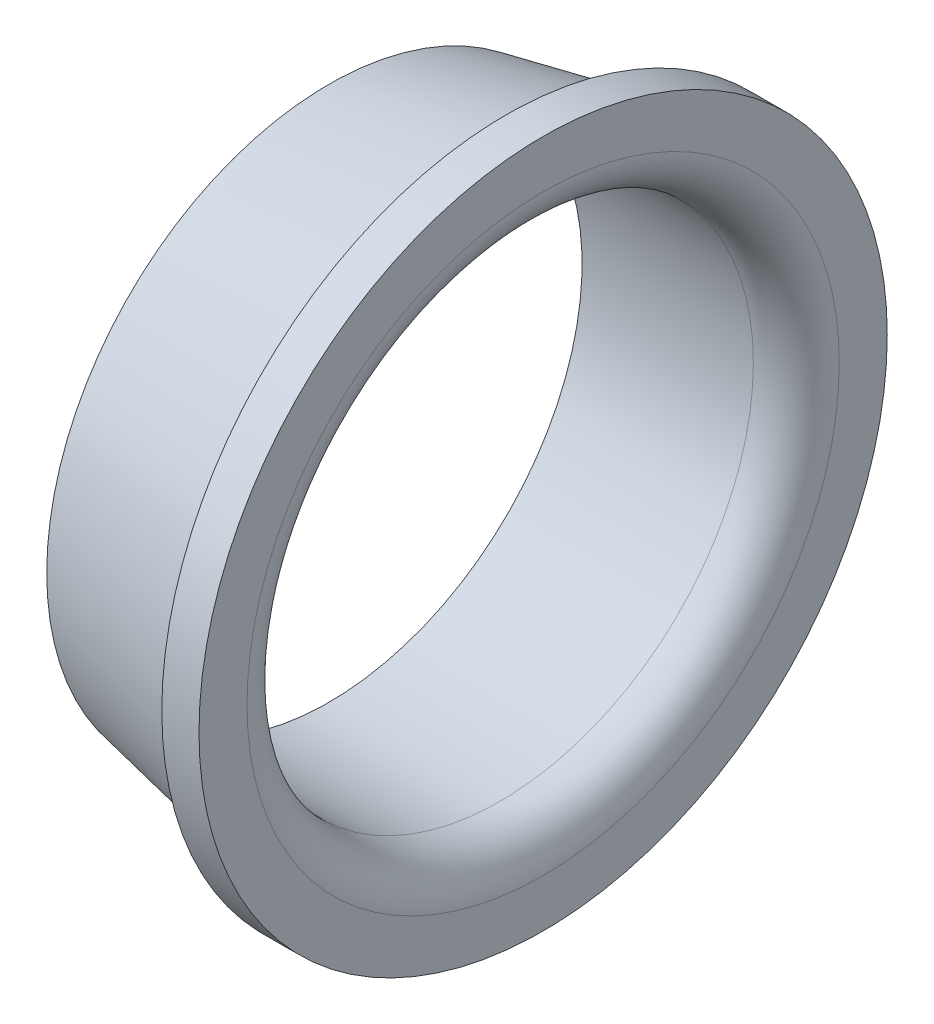
ISO-10303-21;
HEADER;
FILE_DESCRIPTION(('STEP AP214'),'2;1');
FILE_NAME('part.step','',(''),(''),'','','');
FILE_SCHEMA(('AUTOMOTIVE_DESIGN { 1 0 10303 214 1 1 1 1 }'));
ENDSEC;
DATA;
#1=APPLICATION_CONTEXT('core data for automotive mechanical design processes');
#2=APPLICATION_PROTOCOL_DEFINITION('international standard','automotive_design',2000,#1);
#3=PRODUCT_CONTEXT('',#1,'mechanical');
#4=PRODUCT('Part','Part','',(#3));
#5=PRODUCT_RELATED_PRODUCT_CATEGORY('part','',(#4));
#6=PRODUCT_DEFINITION_FORMATION('','',#4);
#7=PRODUCT_DEFINITION_CONTEXT('part definition',#1,'design');
#8=PRODUCT_DEFINITION('design','',#6,#7);
#9=PRODUCT_DEFINITION_SHAPE('','',#8);
#10=(LENGTH_UNIT() NAMED_UNIT(*) SI_UNIT(.MILLI.,.METRE.));
#11=(NAMED_UNIT(*) PLANE_ANGLE_UNIT() SI_UNIT($,.RADIAN.));
#12=(NAMED_UNIT(*) SI_UNIT($,.STERADIAN.) SOLID_ANGLE_UNIT());
#13=UNCERTAINTY_MEASURE_WITH_UNIT(LENGTH_MEASURE(1.E-05),#10,'distance_accuracy_value','');
#14=(GEOMETRIC_REPRESENTATION_CONTEXT(3) GLOBAL_UNCERTAINTY_ASSIGNED_CONTEXT((#13)) GLOBAL_UNIT_ASSIGNED_CONTEXT((#10,
#11,#12)) REPRESENTATION_CONTEXT('',''));
#15=CARTESIAN_POINT('',(0.,0.,0.));
#16=DIRECTION('',(0.,0.,1.));
#17=DIRECTION('',(1.,0.,0.));
#18=AXIS2_PLACEMENT_3D('',#15,#16,#17);
#19=CARTESIAN_POINT('',(13.167,0.,0.));
#20=DIRECTION('',(1.,0.,0.));
#21=DIRECTION('',(0.,0.,-1.));
#22=AXIS2_PLACEMENT_3D('',#19,#20,#21);
#23=TOROIDAL_SURFACE('',#22,24.1375,3.5);
#24=CARTESIAN_POINT('',(13.167,0.,0.));
#25=DIRECTION('',(-1.,0.,0.));
#26=DIRECTION('',(0.,0.,1.));
#27=AXIS2_PLACEMENT_3D('',#24,#25,#26);
#28=CIRCLE('',#27,20.6375);
#29=CARTESIAN_POINT('',(13.167,0.,20.6375));
#30=VERTEX_POINT('',#29);
#31=EDGE_CURVE('E41',#30,#30,#28,.T.);
#32=ORIENTED_EDGE('',*,*,#31,.T.);
#33=EDGE_LOOP('',(#32));
#34=FACE_BOUND('',#33,.T.);
#35=CARTESIAN_POINT('',(16.667,0.,0.));
#36=DIRECTION('',(1.,0.,0.));
#37=DIRECTION('',(0.,0.,-1.));
#38=AXIS2_PLACEMENT_3D('',#35,#36,#37);
#39=CIRCLE('',#38,24.1375000521541);
#40=CARTESIAN_POINT('',(16.667,0.,-24.1375000521541));
#41=VERTEX_POINT('',#40);
#42=EDGE_CURVE('E45',#41,#41,#39,.F.);
#43=ORIENTED_EDGE('',*,*,#42,.F.);
#44=EDGE_LOOP('',(#43));
#45=FACE_BOUND('',#44,.T.);
#46=ADVANCED_FACE('F14',(#34,#45),#23,.T.);
#47=CARTESIAN_POINT('',(16.667,24.1375,0.));
#48=DIRECTION('',(1.,0.,0.));
#49=DIRECTION('',(0.,0.,-1.));
#50=AXIS2_PLACEMENT_3D('',#47,#48,#49);
#51=PLANE('',#50);
#52=ORIENTED_EDGE('',*,*,#42,.T.);
#53=EDGE_LOOP('',(#52));
#54=FACE_BOUND('',#53,.T.);
#55=CARTESIAN_POINT('',(16.667,0.,0.));
#56=DIRECTION('',(-1.,0.,0.));
#57=DIRECTION('',(0.,0.,1.));
#58=AXIS2_PLACEMENT_3D('',#55,#56,#57);
#59=CIRCLE('',#58,28.05);
#60=CARTESIAN_POINT('',(16.667,0.,28.05));
#61=VERTEX_POINT('',#60);
#62=EDGE_CURVE('E19',#61,#61,#59,.T.);
#63=ORIENTED_EDGE('',*,*,#62,.F.);
#64=EDGE_LOOP('',(#63));
#65=FACE_BOUND('',#64,.T.);
#66=ADVANCED_FACE('F59',(#54,#65),#51,.T.);
#67=CARTESIAN_POINT('',(50.,0.,0.));
#68=DIRECTION('',(-1.,0.,0.));
#69=DIRECTION('',(0.,0.,1.));
#70=AXIS2_PLACEMENT_3D('',#67,#68,#69);
#71=CYLINDRICAL_SURFACE('',#70,20.6375);
#72=CARTESIAN_POINT('',(-0.795000000000004,0.,0.));
#73=DIRECTION('',(-1.,0.,0.));
#74=DIRECTION('',(0.,0.,1.));
#75=AXIS2_PLACEMENT_3D('',#72,#73,#74);
#76=CIRCLE('',#75,20.6375);
#77=CARTESIAN_POINT('',(-0.795000000000004,0.,20.6375));
#78=VERTEX_POINT('',#77);
#79=EDGE_CURVE('E36',#78,#78,#76,.F.);
#80=ORIENTED_EDGE('',*,*,#79,.F.);
#81=EDGE_LOOP('',(#80));
#82=FACE_BOUND('',#81,.T.);
#83=ORIENTED_EDGE('',*,*,#31,.F.);
#84=EDGE_LOOP('',(#83));
#85=FACE_BOUND('',#84,.T.);
#86=ADVANCED_FACE('F68',(#82,#85),#71,.F.);
#87=CARTESIAN_POINT('',(50.,0.,0.));
#88=DIRECTION('',(-1.,0.,0.));
#89=DIRECTION('',(0.,0.,1.));
#90=AXIS2_PLACEMENT_3D('',#87,#88,#89);
#91=CYLINDRICAL_SURFACE('',#90,28.05);
#92=ORIENTED_EDGE('',*,*,#62,.T.);
#93=EDGE_LOOP('',(#92));
#94=FACE_BOUND('',#93,.T.);
#95=CARTESIAN_POINT('',(13.6351963553331,0.,0.));
#96=DIRECTION('',(-1.,0.,0.));
#97=DIRECTION('',(0.,0.,1.));
#98=AXIS2_PLACEMENT_3D('',#95,#96,#97);
#99=CIRCLE('',#98,28.05);
#100=CARTESIAN_POINT('',(13.6351963553331,0.,28.05));
#101=VERTEX_POINT('',#100);
#102=EDGE_CURVE('E28',#101,#101,#99,.T.);
#103=ORIENTED_EDGE('',*,*,#102,.F.);
#104=EDGE_LOOP('',(#103));
#105=FACE_BOUND('',#104,.T.);
#106=ADVANCED_FACE('F71',(#94,#105),#91,.T.);
#107=CARTESIAN_POINT('',(-0.795000000000002,22.9969319040494,0.));
#108=DIRECTION('',(-1.,0.,0.));
#109=DIRECTION('',(0.,0.,1.));
#110=AXIS2_PLACEMENT_3D('',#107,#108,#109);
#111=PLANE('',#110);
#112=CARTESIAN_POINT('',(-0.794999999999994,0.,0.));
#113=DIRECTION('',(1.,0.,0.));
#114=DIRECTION('',(0.,0.,-1.));
#115=AXIS2_PLACEMENT_3D('',#112,#113,#114);
#116=CIRCLE('',#115,22.9969319040493);
#117=CARTESIAN_POINT('',(-0.794999999999994,0.,-22.9969319040493));
#118=VERTEX_POINT('',#117);
#119=EDGE_CURVE('E23',#118,#118,#116,.T.);
#120=ORIENTED_EDGE('',*,*,#119,.F.);
#121=EDGE_LOOP('',(#120));
#122=FACE_BOUND('',#121,.T.);
#123=ORIENTED_EDGE('',*,*,#79,.T.);
#124=EDGE_LOOP('',(#123));
#125=FACE_BOUND('',#124,.T.);
#126=ADVANCED_FACE('F75',(#122,#125),#111,.T.);
#127=CARTESIAN_POINT('',(13.6351963553331,28.05,0.));
#128=DIRECTION('',(-1.,0.,0.));
#129=DIRECTION('',(0.,0.,1.));
#130=AXIS2_PLACEMENT_3D('',#127,#128,#129);
#131=PLANE('',#130);
#132=ORIENTED_EDGE('',*,*,#102,.T.);
#133=EDGE_LOOP('',(#132));
#134=FACE_BOUND('',#133,.T.);
#135=CARTESIAN_POINT('',(13.6351963553331,0.,0.));
#136=DIRECTION('',(1.,0.,0.));
#137=DIRECTION('',(0.,0.,-1.));
#138=AXIS2_PLACEMENT_3D('',#135,#136,#137);
#139=CIRCLE('',#138,25.872939245171);
#140=CARTESIAN_POINT('',(13.6351963553331,0.,-25.872939245171));
#141=VERTEX_POINT('',#140);
#142=EDGE_CURVE('E10',#141,#141,#139,.F.);
#143=ORIENTED_EDGE('',*,*,#142,.F.);
#144=EDGE_LOOP('',(#143));
#145=FACE_BOUND('',#144,.T.);
#146=ADVANCED_FACE('F78',(#134,#145),#131,.T.);
#147=CARTESIAN_POINT('',(13.6351963553331,0.,0.));
#148=DIRECTION('',(1.,0.,0.));
#149=DIRECTION('',(0.,0.,-1.));
#150=AXIS2_PLACEMENT_3D('',#147,#148,#149);
#151=CONICAL_SURFACE('',#150,25.872939245171,0.19672700520253);
#152=ORIENTED_EDGE('',*,*,#142,.T.);
#153=EDGE_LOOP('',(#152));
#154=FACE_BOUND('',#153,.T.);
#155=ORIENTED_EDGE('',*,*,#119,.T.);
#156=EDGE_LOOP('',(#155));
#157=FACE_BOUND('',#156,.T.);
#158=ADVANCED_FACE('F82',(#154,#157),#151,.T.);
#159=CLOSED_SHELL('',(#46,#66,#86,#106,#126,#146,#158));
#160=MANIFOLD_SOLID_BREP('B1',#159);
#161=ADVANCED_BREP_SHAPE_REPRESENTATION('',(#18,#160),#14);
#162=SHAPE_DEFINITION_REPRESENTATION(#9,#161);
ENDSEC;
END-ISO-10303-21;
